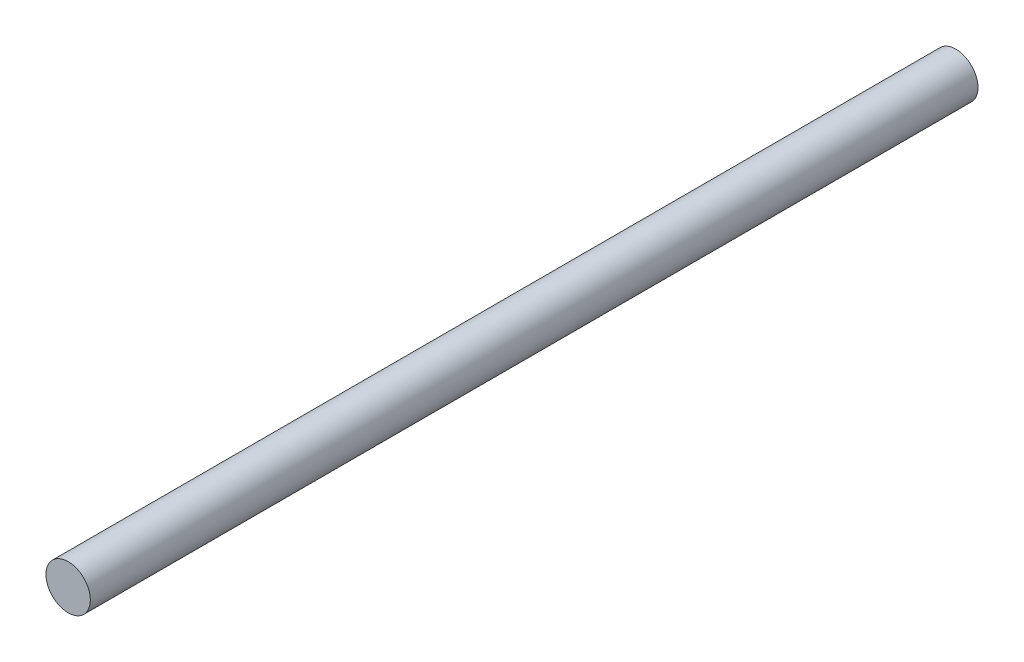
ISO-10303-21;
HEADER;
FILE_DESCRIPTION(('STEP AP214'),'2;1');
FILE_NAME('part.step','',(''),(''),'','','');
FILE_SCHEMA(('AUTOMOTIVE_DESIGN { 1 0 10303 214 1 1 1 1 }'));
ENDSEC;
DATA;
#1=APPLICATION_CONTEXT('core data for automotive mechanical design processes');
#2=APPLICATION_PROTOCOL_DEFINITION('international standard','automotive_design',2000,#1);
#3=PRODUCT_CONTEXT('',#1,'mechanical');
#4=PRODUCT('Part','Part','',(#3));
#5=PRODUCT_RELATED_PRODUCT_CATEGORY('part','',(#4));
#6=PRODUCT_DEFINITION_FORMATION('','',#4);
#7=PRODUCT_DEFINITION_CONTEXT('part definition',#1,'design');
#8=PRODUCT_DEFINITION('design','',#6,#7);
#9=PRODUCT_DEFINITION_SHAPE('','',#8);
#10=(LENGTH_UNIT() NAMED_UNIT(*) SI_UNIT(.MILLI.,.METRE.));
#11=(NAMED_UNIT(*) PLANE_ANGLE_UNIT() SI_UNIT($,.RADIAN.));
#12=(NAMED_UNIT(*) SI_UNIT($,.STERADIAN.) SOLID_ANGLE_UNIT());
#13=UNCERTAINTY_MEASURE_WITH_UNIT(LENGTH_MEASURE(1.E-05),#10,'distance_accuracy_value','');
#14=(GEOMETRIC_REPRESENTATION_CONTEXT(3) GLOBAL_UNCERTAINTY_ASSIGNED_CONTEXT((#13)) GLOBAL_UNIT_ASSIGNED_CONTEXT((#10,
#11,#12)) REPRESENTATION_CONTEXT('',''));
#15=CARTESIAN_POINT('',(0.,0.,0.));
#16=DIRECTION('',(0.,0.,1.));
#17=DIRECTION('',(1.,0.,0.));
#18=AXIS2_PLACEMENT_3D('',#15,#16,#17);
#19=CARTESIAN_POINT('',(0.,0.,127.));
#20=DIRECTION('',(0.,0.,-1.));
#21=DIRECTION('',(-1.,0.,0.));
#22=AXIS2_PLACEMENT_3D('',#19,#20,#21);
#23=CYLINDRICAL_SURFACE('',#22,3.175);
#24=CARTESIAN_POINT('',(0.,0.,127.));
#25=DIRECTION('',(0.,0.,1.));
#26=DIRECTION('',(1.,0.,0.));
#27=AXIS2_PLACEMENT_3D('',#24,#25,#26);
#28=CIRCLE('',#27,3.175);
#29=CARTESIAN_POINT('',(3.175,0.,127.));
#30=VERTEX_POINT('',#29);
#31=EDGE_CURVE('E10',#30,#30,#28,.T.);
#32=ORIENTED_EDGE('',*,*,#31,.F.);
#33=EDGE_LOOP('',(#32));
#34=FACE_BOUND('',#33,.T.);
#35=CARTESIAN_POINT('',(0.,0.,0.));
#36=DIRECTION('',(0.,0.,1.));
#37=DIRECTION('',(1.,0.,0.));
#38=AXIS2_PLACEMENT_3D('',#35,#36,#37);
#39=CIRCLE('',#38,3.175);
#40=CARTESIAN_POINT('',(3.175,0.,0.));
#41=VERTEX_POINT('',#40);
#42=EDGE_CURVE('E46',#41,#41,#39,.T.);
#43=ORIENTED_EDGE('',*,*,#42,.T.);
#44=EDGE_LOOP('',(#43));
#45=FACE_BOUND('',#44,.T.);
#46=ADVANCED_FACE('F43',(#34,#45),#23,.T.);
#47=CARTESIAN_POINT('',(0.,0.,127.));
#48=DIRECTION('',(0.,0.,1.));
#49=DIRECTION('',(1.,0.,0.));
#50=AXIS2_PLACEMENT_3D('',#47,#48,#49);
#51=PLANE('',#50);
#52=ORIENTED_EDGE('',*,*,#31,.T.);
#53=EDGE_LOOP('',(#52));
#54=FACE_BOUND('',#53,.T.);
#55=ADVANCED_FACE('F58',(#54),#51,.T.);
#56=CARTESIAN_POINT('',(0.,0.,0.));
#57=DIRECTION('',(0.,0.,1.));
#58=DIRECTION('',(1.,0.,0.));
#59=AXIS2_PLACEMENT_3D('',#56,#57,#58);
#60=PLANE('',#59);
#61=ORIENTED_EDGE('',*,*,#42,.F.);
#62=EDGE_LOOP('',(#61));
#63=FACE_BOUND('',#62,.T.);
#64=ADVANCED_FACE('F56',(#63),#60,.F.);
#65=CLOSED_SHELL('',(#46,#55,#64));
#66=MANIFOLD_SOLID_BREP('B2',#65);
#67=ADVANCED_BREP_SHAPE_REPRESENTATION('',(#18,#66),#14);
#68=SHAPE_DEFINITION_REPRESENTATION(#9,#67);
ENDSEC;
END-ISO-10303-21;
